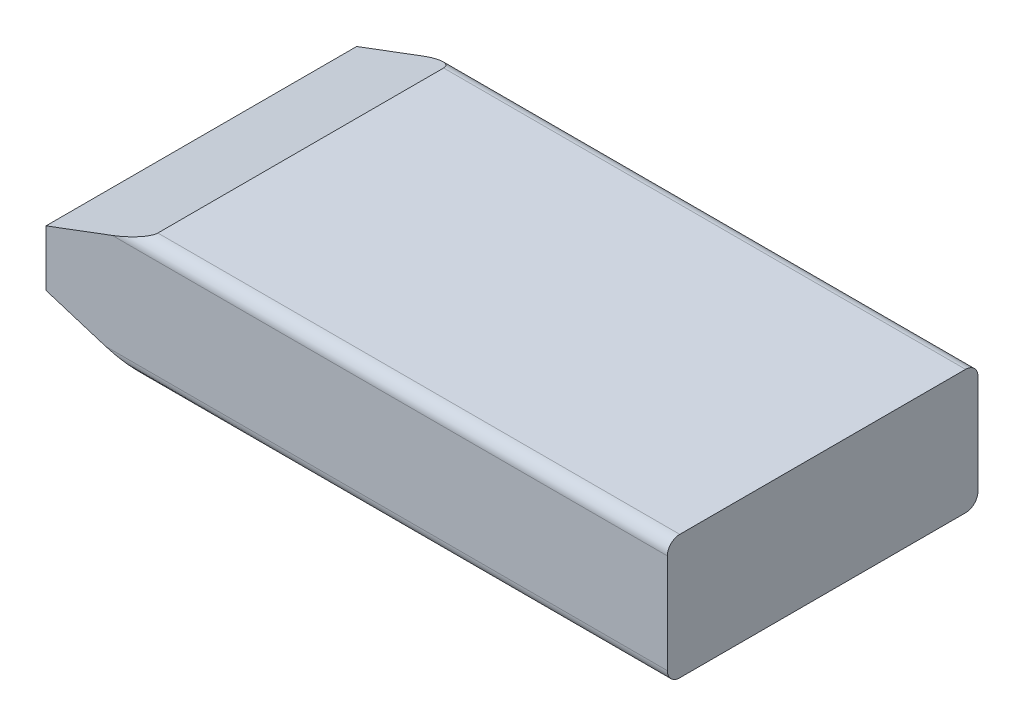
ISO-10303-21;
HEADER;
FILE_DESCRIPTION(('STEP AP214'),'2;1');
FILE_NAME('part.step','',(''),(''),'','','');
FILE_SCHEMA(('AUTOMOTIVE_DESIGN { 1 0 10303 214 1 1 1 1 }'));
ENDSEC;
DATA;
#1=APPLICATION_CONTEXT('core data for automotive mechanical design processes');
#2=APPLICATION_PROTOCOL_DEFINITION('international standard','automotive_design',2000,#1);
#3=PRODUCT_CONTEXT('',#1,'mechanical');
#4=PRODUCT('Part','Part','',(#3));
#5=PRODUCT_RELATED_PRODUCT_CATEGORY('part','',(#4));
#6=PRODUCT_DEFINITION_FORMATION('','',#4);
#7=PRODUCT_DEFINITION_CONTEXT('part definition',#1,'design');
#8=PRODUCT_DEFINITION('design','',#6,#7);
#9=PRODUCT_DEFINITION_SHAPE('','',#8);
#10=(LENGTH_UNIT() NAMED_UNIT(*) SI_UNIT(.MILLI.,.METRE.));
#11=(NAMED_UNIT(*) PLANE_ANGLE_UNIT() SI_UNIT($,.RADIAN.));
#12=(NAMED_UNIT(*) SI_UNIT($,.STERADIAN.) SOLID_ANGLE_UNIT());
#13=UNCERTAINTY_MEASURE_WITH_UNIT(LENGTH_MEASURE(1.E-05),#10,'distance_accuracy_value','');
#14=(GEOMETRIC_REPRESENTATION_CONTEXT(3) GLOBAL_UNCERTAINTY_ASSIGNED_CONTEXT((#13)) GLOBAL_UNIT_ASSIGNED_CONTEXT((#10,
#11,#12)) REPRESENTATION_CONTEXT('',''));
#15=CARTESIAN_POINT('',(0.,0.,0.));
#16=DIRECTION('',(0.,0.,1.));
#17=DIRECTION('',(1.,0.,0.));
#18=AXIS2_PLACEMENT_3D('',#15,#16,#17);
#19=CARTESIAN_POINT('',(25.,10.,12.5));
#20=DIRECTION('',(-1.,0.,0.));
#21=DIRECTION('',(0.,0.,1.));
#22=AXIS2_PLACEMENT_3D('',#19,#20,#21);
#23=PLANE('',#22);
#24=DIRECTION('',(0.,-1.,0.));
#25=VECTOR('',#24,1.);
#26=CARTESIAN_POINT('',(25.,10.,12.5));
#27=LINE('',#26,#25);
#28=CARTESIAN_POINT('',(25.,9.,12.5));
#29=VERTEX_POINT('',#28);
#30=CARTESIAN_POINT('',(25.,0.999999999999999,12.5));
#31=VERTEX_POINT('',#30);
#32=EDGE_CURVE('E148',#29,#31,#27,.T.);
#33=ORIENTED_EDGE('',*,*,#32,.T.);
#34=CARTESIAN_POINT('',(25.,0.999999999999999,11.5));
#35=DIRECTION('',(-1.,0.,0.));
#36=DIRECTION('',(0.,0.,1.));
#37=AXIS2_PLACEMENT_3D('',#34,#35,#36);
#38=CIRCLE('',#37,1.);
#39=CARTESIAN_POINT('',(25.,0.,11.5));
#40=VERTEX_POINT('',#39);
#41=EDGE_CURVE('E168',#31,#40,#38,.F.);
#42=ORIENTED_EDGE('',*,*,#41,.T.);
#43=DIRECTION('',(0.,0.,-1.));
#44=VECTOR('',#43,1.);
#45=CARTESIAN_POINT('',(25.,0.,12.5));
#46=LINE('',#45,#44);
#47=CARTESIAN_POINT('',(25.,0.,-11.5));
#48=VERTEX_POINT('',#47);
#49=EDGE_CURVE('E201',#40,#48,#46,.T.);
#50=ORIENTED_EDGE('',*,*,#49,.T.);
#51=CARTESIAN_POINT('',(25.,0.999999999999999,-11.5));
#52=DIRECTION('',(-1.,0.,0.));
#53=DIRECTION('',(0.,0.,1.));
#54=AXIS2_PLACEMENT_3D('',#51,#52,#53);
#55=CIRCLE('',#54,1.);
#56=CARTESIAN_POINT('',(25.,0.999999999999999,-12.5));
#57=VERTEX_POINT('',#56);
#58=EDGE_CURVE('E162',#48,#57,#55,.F.);
#59=ORIENTED_EDGE('',*,*,#58,.T.);
#60=DIRECTION('',(0.,-1.,0.));
#61=VECTOR('',#60,1.);
#62=CARTESIAN_POINT('',(25.,10.,-12.5));
#63=LINE('',#62,#61);
#64=CARTESIAN_POINT('',(25.,9.,-12.5));
#65=VERTEX_POINT('',#64);
#66=EDGE_CURVE('E150',#65,#57,#63,.T.);
#67=ORIENTED_EDGE('',*,*,#66,.F.);
#68=CARTESIAN_POINT('',(25.,9.,-11.5));
#69=DIRECTION('',(-1.,0.,0.));
#70=DIRECTION('',(0.,0.,1.));
#71=AXIS2_PLACEMENT_3D('',#68,#69,#70);
#72=CIRCLE('',#71,1.);
#73=CARTESIAN_POINT('',(25.,10.,-11.5));
#74=VERTEX_POINT('',#73);
#75=EDGE_CURVE('E164',#65,#74,#72,.F.);
#76=ORIENTED_EDGE('',*,*,#75,.T.);
#77=DIRECTION('',(0.,0.,-1.));
#78=VECTOR('',#77,1.);
#79=CARTESIAN_POINT('',(25.,10.,12.5));
#80=LINE('',#79,#78);
#81=CARTESIAN_POINT('',(25.,10.,11.5));
#82=VERTEX_POINT('',#81);
#83=EDGE_CURVE('E153',#82,#74,#80,.T.);
#84=ORIENTED_EDGE('',*,*,#83,.F.);
#85=CARTESIAN_POINT('',(25.,9.,11.5));
#86=DIRECTION('',(-1.,0.,0.));
#87=DIRECTION('',(0.,0.,1.));
#88=AXIS2_PLACEMENT_3D('',#85,#86,#87);
#89=CIRCLE('',#88,1.);
#90=EDGE_CURVE('E166',#82,#29,#89,.F.);
#91=ORIENTED_EDGE('',*,*,#90,.T.);
#92=EDGE_LOOP('',(#33,#42,#50,#59,#67,#76,#84,#91));
#93=FACE_BOUND('',#92,.T.);
#94=ADVANCED_FACE('F47',(#93),#23,.F.);
#95=CARTESIAN_POINT('',(-25.,10.,-12.5));
#96=DIRECTION('',(0.,0.,1.));
#97=DIRECTION('',(1.,0.,0.));
#98=AXIS2_PLACEMENT_3D('',#95,#96,#97);
#99=PLANE('',#98);
#100=DIRECTION('',(-1.,0.,0.));
#101=VECTOR('',#100,1.);
#102=CARTESIAN_POINT('',(-25.,0.999999999999999,-12.5));
#103=LINE('',#102,#101);
#104=CARTESIAN_POINT('',(-20.2,0.999999999999999,-12.5));
#105=VERTEX_POINT('',#104);
#106=EDGE_CURVE('E180',#57,#105,#103,.T.);
#107=ORIENTED_EDGE('',*,*,#106,.T.);
#108=DIRECTION('',(-0.95447997803503,0.298274993135947,0.));
#109=VECTOR('',#108,1.);
#110=CARTESIAN_POINT('',(-27.135231316726,3.16725978647687,-12.5));
#111=LINE('',#110,#109);
#112=CARTESIAN_POINT('',(-25.,2.5,-12.5));
#113=VERTEX_POINT('',#112);
#114=EDGE_CURVE('E69',#105,#113,#111,.T.);
#115=ORIENTED_EDGE('',*,*,#114,.T.);
#116=DIRECTION('',(0.,-1.,0.));
#117=VECTOR('',#116,1.);
#118=CARTESIAN_POINT('',(-25.,10.,-12.5));
#119=LINE('',#118,#117);
#120=CARTESIAN_POINT('',(-25.,7.,-12.5));
#121=VERTEX_POINT('',#120);
#122=EDGE_CURVE('E147',#121,#113,#119,.T.);
#123=ORIENTED_EDGE('',*,*,#122,.F.);
#124=DIRECTION('',(0.936329177569045,0.351123441588392,0.));
#125=VECTOR('',#124,1.);
#126=CARTESIAN_POINT('',(-24.013698630137,7.36986301369863,-12.5));
#127=LINE('',#126,#125);
#128=CARTESIAN_POINT('',(-19.6666666666667,9.,-12.5));
#129=VERTEX_POINT('',#128);
#130=EDGE_CURVE('E127',#121,#129,#127,.T.);
#131=ORIENTED_EDGE('',*,*,#130,.T.);
#132=DIRECTION('',(-1.,0.,0.));
#133=VECTOR('',#132,1.);
#134=CARTESIAN_POINT('',(-25.,9.,-12.5));
#135=LINE('',#134,#133);
#136=EDGE_CURVE('E183',#129,#65,#135,.F.);
#137=ORIENTED_EDGE('',*,*,#136,.T.);
#138=ORIENTED_EDGE('',*,*,#66,.T.);
#139=EDGE_LOOP('',(#107,#115,#123,#131,#137,#138));
#140=FACE_BOUND('',#139,.T.);
#141=ADVANCED_FACE('F203',(#140),#99,.F.);
#142=CARTESIAN_POINT('',(-25.,10.,12.5));
#143=DIRECTION('',(1.,0.,0.));
#144=DIRECTION('',(0.,0.,-1.));
#145=AXIS2_PLACEMENT_3D('',#142,#143,#144);
#146=PLANE('',#145);
#147=ORIENTED_EDGE('',*,*,#122,.T.);
#148=DIRECTION('',(0.,0.,1.));
#149=VECTOR('',#148,1.);
#150=CARTESIAN_POINT('',(-25.,2.5,-15.5));
#151=LINE('',#150,#149);
#152=CARTESIAN_POINT('',(-25.,2.5,12.5));
#153=VERTEX_POINT('',#152);
#154=EDGE_CURVE('E146',#113,#153,#151,.T.);
#155=ORIENTED_EDGE('',*,*,#154,.T.);
#156=DIRECTION('',(0.,-1.,0.));
#157=VECTOR('',#156,1.);
#158=CARTESIAN_POINT('',(-25.,10.,12.5));
#159=LINE('',#158,#157);
#160=CARTESIAN_POINT('',(-25.,7.,12.5));
#161=VERTEX_POINT('',#160);
#162=EDGE_CURVE('E139',#161,#153,#159,.T.);
#163=ORIENTED_EDGE('',*,*,#162,.F.);
#164=DIRECTION('',(0.,0.,1.));
#165=VECTOR('',#164,1.);
#166=CARTESIAN_POINT('',(-25.,7.,-15.5));
#167=LINE('',#166,#165);
#168=EDGE_CURVE('E121',#121,#161,#167,.T.);
#169=ORIENTED_EDGE('',*,*,#168,.F.);
#170=EDGE_LOOP('',(#147,#155,#163,#169));
#171=FACE_BOUND('',#170,.T.);
#172=ADVANCED_FACE('F145',(#171),#146,.F.);
#173=CARTESIAN_POINT('',(-25.,10.,12.5));
#174=DIRECTION('',(0.,0.,-1.));
#175=DIRECTION('',(-1.,0.,0.));
#176=AXIS2_PLACEMENT_3D('',#173,#174,#175);
#177=PLANE('',#176);
#178=ORIENTED_EDGE('',*,*,#162,.T.);
#179=DIRECTION('',(-0.95447997803503,0.298274993135947,0.));
#180=VECTOR('',#179,1.);
#181=CARTESIAN_POINT('',(-17.,0.,12.5));
#182=LINE('',#181,#180);
#183=CARTESIAN_POINT('',(-20.2,0.999999999999999,12.5));
#184=VERTEX_POINT('',#183);
#185=EDGE_CURVE('E132',#184,#153,#182,.T.);
#186=ORIENTED_EDGE('',*,*,#185,.F.);
#187=DIRECTION('',(1.,0.,0.));
#188=VECTOR('',#187,1.);
#189=CARTESIAN_POINT('',(25.,0.999999999999999,12.5));
#190=LINE('',#189,#188);
#191=EDGE_CURVE('E160',#184,#31,#190,.T.);
#192=ORIENTED_EDGE('',*,*,#191,.T.);
#193=ORIENTED_EDGE('',*,*,#32,.F.);
#194=DIRECTION('',(1.,0.,0.));
#195=VECTOR('',#194,1.);
#196=CARTESIAN_POINT('',(-25.,9.,12.5));
#197=LINE('',#196,#195);
#198=CARTESIAN_POINT('',(-19.6666666666667,9.,12.5));
#199=VERTEX_POINT('',#198);
#200=EDGE_CURVE('E142',#29,#199,#197,.F.);
#201=ORIENTED_EDGE('',*,*,#200,.T.);
#202=DIRECTION('',(0.936329177569045,0.351123441588392,0.));
#203=VECTOR('',#202,1.);
#204=CARTESIAN_POINT('',(-25.,7.,12.5));
#205=LINE('',#204,#203);
#206=EDGE_CURVE('E124',#161,#199,#205,.T.);
#207=ORIENTED_EDGE('',*,*,#206,.F.);
#208=EDGE_LOOP('',(#178,#186,#192,#193,#201,#207));
#209=FACE_BOUND('',#208,.T.);
#210=ADVANCED_FACE('F137',(#209),#177,.F.);
#211=CARTESIAN_POINT('',(0.,10.,0.));
#212=DIRECTION('',(0.,-1.,0.));
#213=DIRECTION('',(0.,0.,-1.));
#214=AXIS2_PLACEMENT_3D('',#211,#212,#213);
#215=PLANE('',#214);
#216=DIRECTION('',(-1.,0.,0.));
#217=VECTOR('',#216,1.);
#218=CARTESIAN_POINT('',(0.,10.,-11.5));
#219=LINE('',#218,#217);
#220=CARTESIAN_POINT('',(-17.,10.,-11.5));
#221=VERTEX_POINT('',#220);
#222=EDGE_CURVE('E175',#74,#221,#219,.T.);
#223=ORIENTED_EDGE('',*,*,#222,.T.);
#224=DIRECTION('',(0.,0.,1.));
#225=VECTOR('',#224,1.);
#226=CARTESIAN_POINT('',(-17.,10.,-15.5));
#227=LINE('',#226,#225);
#228=CARTESIAN_POINT('',(-17.,10.,11.5));
#229=VERTEX_POINT('',#228);
#230=EDGE_CURVE('E61',#221,#229,#227,.T.);
#231=ORIENTED_EDGE('',*,*,#230,.T.);
#232=DIRECTION('',(1.,0.,0.));
#233=VECTOR('',#232,1.);
#234=CARTESIAN_POINT('',(0.,10.,11.5));
#235=LINE('',#234,#233);
#236=EDGE_CURVE('E178',#229,#82,#235,.T.);
#237=ORIENTED_EDGE('',*,*,#236,.T.);
#238=ORIENTED_EDGE('',*,*,#83,.T.);
#239=EDGE_LOOP('',(#223,#231,#237,#238));
#240=FACE_BOUND('',#239,.T.);
#241=ADVANCED_FACE('F211',(#240),#215,.F.);
#242=CARTESIAN_POINT('',(0.,0.,0.));
#243=DIRECTION('',(0.,-1.,0.));
#244=DIRECTION('',(0.,0.,-1.));
#245=AXIS2_PLACEMENT_3D('',#242,#243,#244);
#246=PLANE('',#245);
#247=DIRECTION('',(0.,0.,1.));
#248=VECTOR('',#247,1.);
#249=CARTESIAN_POINT('',(-17.,0.,-15.5));
#250=LINE('',#249,#248);
#251=CARTESIAN_POINT('',(-17.,0.,-11.5));
#252=VERTEX_POINT('',#251);
#253=CARTESIAN_POINT('',(-17.,0.,11.5));
#254=VERTEX_POINT('',#253);
#255=EDGE_CURVE('E186',#252,#254,#250,.T.);
#256=ORIENTED_EDGE('',*,*,#255,.F.);
#257=DIRECTION('',(-1.,0.,0.));
#258=VECTOR('',#257,1.);
#259=CARTESIAN_POINT('',(25.,0.,-11.5));
#260=LINE('',#259,#258);
#261=EDGE_CURVE('E170',#252,#48,#260,.F.);
#262=ORIENTED_EDGE('',*,*,#261,.T.);
#263=ORIENTED_EDGE('',*,*,#49,.F.);
#264=DIRECTION('',(1.,0.,0.));
#265=VECTOR('',#264,1.);
#266=CARTESIAN_POINT('',(-25.,0.,11.5));
#267=LINE('',#266,#265);
#268=EDGE_CURVE('E172',#40,#254,#267,.F.);
#269=ORIENTED_EDGE('',*,*,#268,.T.);
#270=EDGE_LOOP('',(#256,#262,#263,#269));
#271=FACE_BOUND('',#270,.T.);
#272=ADVANCED_FACE('F192',(#271),#246,.T.);
#273=CARTESIAN_POINT('',(-25.,0.999999999999999,11.5));
#274=DIRECTION('',(-1.,0.,0.));
#275=DIRECTION('',(0.,0.,1.));
#276=AXIS2_PLACEMENT_3D('',#273,#274,#275);
#277=CYLINDRICAL_SURFACE('',#276,1.);
#278=CARTESIAN_POINT('',(-20.2,0.999999999999999,11.5));
#279=DIRECTION('',(0.298274993135947,0.95447997803503,0.));
#280=DIRECTION('',(-0.95447997803503,0.298274993135947,0.));
#281=AXIS2_PLACEMENT_3D('',#278,#279,#280);
#282=ELLIPSE('',#281,3.35261092284804,1.);
#283=EDGE_CURVE('E219',#254,#184,#282,.F.);
#284=ORIENTED_EDGE('',*,*,#283,.F.);
#285=ORIENTED_EDGE('',*,*,#268,.F.);
#286=ORIENTED_EDGE('',*,*,#41,.F.);
#287=ORIENTED_EDGE('',*,*,#191,.F.);
#288=EDGE_LOOP('',(#284,#285,#286,#287));
#289=FACE_BOUND('',#288,.T.);
#290=ADVANCED_FACE('F227',(#289),#277,.T.);
#291=CARTESIAN_POINT('',(0.,9.,11.5));
#292=DIRECTION('',(1.,0.,0.));
#293=DIRECTION('',(0.,0.,-1.));
#294=AXIS2_PLACEMENT_3D('',#291,#292,#293);
#295=CYLINDRICAL_SURFACE('',#294,1.);
#296=CARTESIAN_POINT('',(-19.6666666666667,9.,11.5));
#297=DIRECTION('',(0.351123441588392,-0.936329177569044,0.));
#298=DIRECTION('',(0.936329177569045,0.351123441588392,0.));
#299=AXIS2_PLACEMENT_3D('',#296,#297,#298);
#300=ELLIPSE('',#299,2.84800124843918,1.);
#301=EDGE_CURVE('E215',#199,#229,#300,.F.);
#302=ORIENTED_EDGE('',*,*,#301,.F.);
#303=ORIENTED_EDGE('',*,*,#200,.F.);
#304=ORIENTED_EDGE('',*,*,#90,.F.);
#305=ORIENTED_EDGE('',*,*,#236,.F.);
#306=EDGE_LOOP('',(#302,#303,#304,#305));
#307=FACE_BOUND('',#306,.T.);
#308=ADVANCED_FACE('F229',(#307),#295,.T.);
#309=CARTESIAN_POINT('',(0.,9.,-11.5));
#310=DIRECTION('',(-1.,0.,0.));
#311=DIRECTION('',(0.,0.,1.));
#312=AXIS2_PLACEMENT_3D('',#309,#310,#311);
#313=CYLINDRICAL_SURFACE('',#312,1.);
#314=CARTESIAN_POINT('',(-19.6666666666667,9.,-11.5));
#315=DIRECTION('',(0.351123441588392,-0.936329177569044,0.));
#316=DIRECTION('',(-0.936329177569045,-0.351123441588392,0.));
#317=AXIS2_PLACEMENT_3D('',#314,#315,#316);
#318=ELLIPSE('',#317,2.84800124843918,1.);
#319=EDGE_CURVE('E11',#221,#129,#318,.F.);
#320=ORIENTED_EDGE('',*,*,#319,.F.);
#321=ORIENTED_EDGE('',*,*,#222,.F.);
#322=ORIENTED_EDGE('',*,*,#75,.F.);
#323=ORIENTED_EDGE('',*,*,#136,.F.);
#324=EDGE_LOOP('',(#320,#321,#322,#323));
#325=FACE_BOUND('',#324,.T.);
#326=ADVANCED_FACE('F206',(#325),#313,.T.);
#327=CARTESIAN_POINT('',(-25.,0.999999999999999,-11.5));
#328=DIRECTION('',(1.,0.,0.));
#329=DIRECTION('',(0.,0.,-1.));
#330=AXIS2_PLACEMENT_3D('',#327,#328,#329);
#331=CYLINDRICAL_SURFACE('',#330,1.);
#332=CARTESIAN_POINT('',(-20.2,0.999999999999999,-11.5));
#333=DIRECTION('',(0.298274993135947,0.95447997803503,0.));
#334=DIRECTION('',(0.95447997803503,-0.298274993135947,0.));
#335=AXIS2_PLACEMENT_3D('',#332,#333,#334);
#336=ELLIPSE('',#335,3.35261092284804,1.);
#337=EDGE_CURVE('E55',#105,#252,#336,.F.);
#338=ORIENTED_EDGE('',*,*,#337,.F.);
#339=ORIENTED_EDGE('',*,*,#106,.F.);
#340=ORIENTED_EDGE('',*,*,#58,.F.);
#341=ORIENTED_EDGE('',*,*,#261,.F.);
#342=EDGE_LOOP('',(#338,#339,#340,#341));
#343=FACE_BOUND('',#342,.T.);
#344=ADVANCED_FACE('F49',(#343),#331,.T.);
#345=CARTESIAN_POINT('',(-17.,0.,-15.5));
#346=DIRECTION('',(0.298274993135947,0.95447997803503,0.));
#347=DIRECTION('',(-0.95447997803503,0.298274993135947,0.));
#348=AXIS2_PLACEMENT_3D('',#345,#346,#347);
#349=PLANE('',#348);
#350=ORIENTED_EDGE('',*,*,#283,.T.);
#351=ORIENTED_EDGE('',*,*,#185,.T.);
#352=ORIENTED_EDGE('',*,*,#154,.F.);
#353=ORIENTED_EDGE('',*,*,#114,.F.);
#354=ORIENTED_EDGE('',*,*,#337,.T.);
#355=ORIENTED_EDGE('',*,*,#255,.T.);
#356=EDGE_LOOP('',(#350,#351,#352,#353,#354,#355));
#357=FACE_BOUND('',#356,.T.);
#358=ADVANCED_FACE('F185',(#357),#349,.F.);
#359=CARTESIAN_POINT('',(-25.,7.,-15.5));
#360=DIRECTION('',(0.351123441588392,-0.936329177569044,0.));
#361=DIRECTION('',(0.936329177569045,0.351123441588392,0.));
#362=AXIS2_PLACEMENT_3D('',#359,#360,#361);
#363=PLANE('',#362);
#364=ORIENTED_EDGE('',*,*,#301,.T.);
#365=ORIENTED_EDGE('',*,*,#230,.F.);
#366=ORIENTED_EDGE('',*,*,#319,.T.);
#367=ORIENTED_EDGE('',*,*,#130,.F.);
#368=ORIENTED_EDGE('',*,*,#168,.T.);
#369=ORIENTED_EDGE('',*,*,#206,.T.);
#370=EDGE_LOOP('',(#364,#365,#366,#367,#368,#369));
#371=FACE_BOUND('',#370,.T.);
#372=ADVANCED_FACE('F123',(#371),#363,.F.);
#373=CLOSED_SHELL('',(#94,#141,#172,#210,#241,#272,#290,#308,#326,#344,#358,#372));
#374=MANIFOLD_SOLID_BREP('B2',#373);
#375=ADVANCED_BREP_SHAPE_REPRESENTATION('',(#18,#374),#14);
#376=SHAPE_DEFINITION_REPRESENTATION(#9,#375);
ENDSEC;
END-ISO-10303-21;
